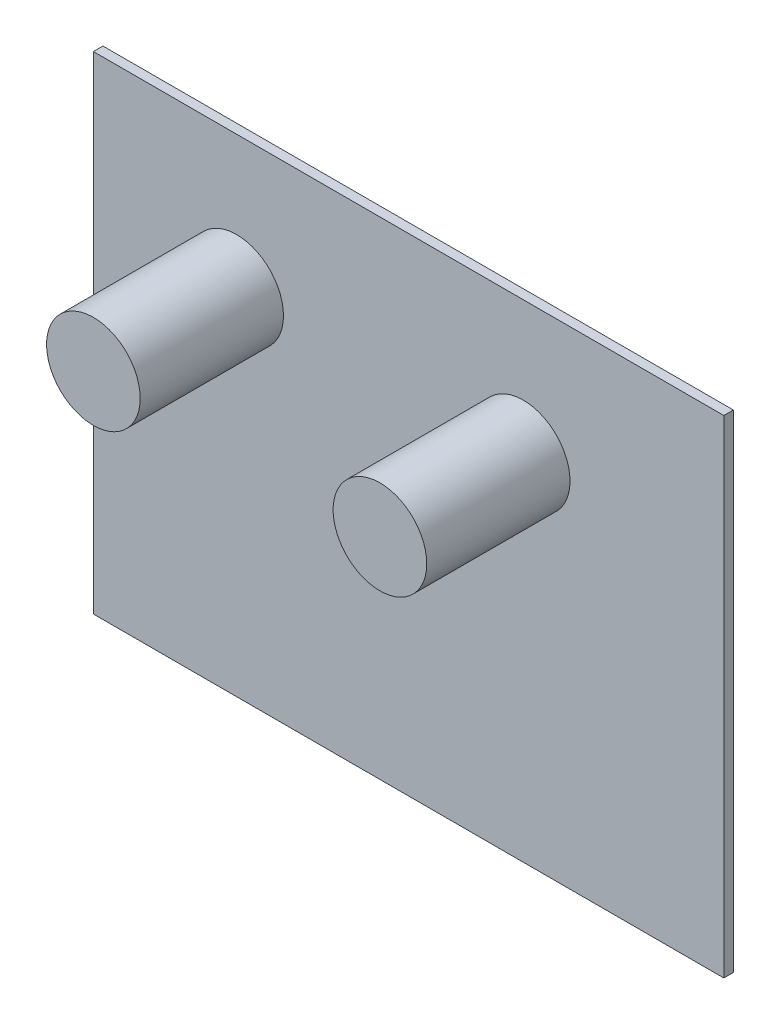
ISO-10303-21;
HEADER;
FILE_DESCRIPTION(('STEP AP214'),'2;1');
FILE_NAME('part.step','',(''),(''),'','','');
FILE_SCHEMA(('AUTOMOTIVE_DESIGN { 1 0 10303 214 1 1 1 1 }'));
ENDSEC;
DATA;
#1=APPLICATION_CONTEXT('core data for automotive mechanical design processes');
#2=APPLICATION_PROTOCOL_DEFINITION('international standard','automotive_design',2000,#1);
#3=PRODUCT_CONTEXT('',#1,'mechanical');
#4=PRODUCT('Part','Part','',(#3));
#5=PRODUCT_RELATED_PRODUCT_CATEGORY('part','',(#4));
#6=PRODUCT_DEFINITION_FORMATION('','',#4);
#7=PRODUCT_DEFINITION_CONTEXT('part definition',#1,'design');
#8=PRODUCT_DEFINITION('design','',#6,#7);
#9=PRODUCT_DEFINITION_SHAPE('','',#8);
#10=(LENGTH_UNIT() NAMED_UNIT(*) SI_UNIT(.MILLI.,.METRE.));
#11=(NAMED_UNIT(*) PLANE_ANGLE_UNIT() SI_UNIT($,.RADIAN.));
#12=(NAMED_UNIT(*) SI_UNIT($,.STERADIAN.) SOLID_ANGLE_UNIT());
#13=UNCERTAINTY_MEASURE_WITH_UNIT(LENGTH_MEASURE(1.E-05),#10,'distance_accuracy_value','');
#14=(GEOMETRIC_REPRESENTATION_CONTEXT(3) GLOBAL_UNCERTAINTY_ASSIGNED_CONTEXT((#13)) GLOBAL_UNIT_ASSIGNED_CONTEXT((#10,
#11,#12)) REPRESENTATION_CONTEXT('',''));
#15=CARTESIAN_POINT('',(0.,0.,0.));
#16=DIRECTION('',(0.,0.,1.));
#17=DIRECTION('',(1.,0.,0.));
#18=AXIS2_PLACEMENT_3D('',#15,#16,#17);
#19=CARTESIAN_POINT('',(0.,0.,1.));
#20=DIRECTION('',(0.,1.,0.));
#21=DIRECTION('',(0.,0.,1.));
#22=AXIS2_PLACEMENT_3D('',#19,#20,#21);
#23=PLANE('',#22);
#24=DIRECTION('',(1.,0.,0.));
#25=VECTOR('',#24,1.);
#26=CARTESIAN_POINT('',(0.,0.,0.));
#27=LINE('',#26,#25);
#28=CARTESIAN_POINT('',(0.,0.,0.));
#29=VERTEX_POINT('',#28);
#30=CARTESIAN_POINT('',(66.,0.,0.));
#31=VERTEX_POINT('',#30);
#32=EDGE_CURVE('E115',#29,#31,#27,.T.);
#33=ORIENTED_EDGE('',*,*,#32,.T.);
#34=DIRECTION('',(0.,0.,-1.));
#35=VECTOR('',#34,1.);
#36=CARTESIAN_POINT('',(66.,0.,1.));
#37=LINE('',#36,#35);
#38=CARTESIAN_POINT('',(66.,0.,1.));
#39=VERTEX_POINT('',#38);
#40=EDGE_CURVE('E12',#39,#31,#37,.T.);
#41=ORIENTED_EDGE('',*,*,#40,.F.);
#42=DIRECTION('',(1.,0.,0.));
#43=VECTOR('',#42,1.);
#44=CARTESIAN_POINT('',(0.,0.,1.));
#45=LINE('',#44,#43);
#46=CARTESIAN_POINT('',(0.,0.,1.));
#47=VERTEX_POINT('',#46);
#48=EDGE_CURVE('E97',#47,#39,#45,.T.);
#49=ORIENTED_EDGE('',*,*,#48,.F.);
#50=DIRECTION('',(0.,0.,-1.));
#51=VECTOR('',#50,1.);
#52=CARTESIAN_POINT('',(0.,0.,1.));
#53=LINE('',#52,#51);
#54=EDGE_CURVE('E64',#47,#29,#53,.T.);
#55=ORIENTED_EDGE('',*,*,#54,.T.);
#56=EDGE_LOOP('',(#33,#41,#49,#55));
#57=FACE_BOUND('',#56,.T.);
#58=ADVANCED_FACE('F47',(#57),#23,.F.);
#59=CARTESIAN_POINT('',(66.,0.,1.));
#60=DIRECTION('',(-1.,0.,0.));
#61=DIRECTION('',(0.,0.,1.));
#62=AXIS2_PLACEMENT_3D('',#59,#60,#61);
#63=PLANE('',#62);
#64=DIRECTION('',(0.,1.,0.));
#65=VECTOR('',#64,1.);
#66=CARTESIAN_POINT('',(66.,0.,0.));
#67=LINE('',#66,#65);
#68=CARTESIAN_POINT('',(66.,51.,0.));
#69=VERTEX_POINT('',#68);
#70=EDGE_CURVE('E103',#31,#69,#67,.T.);
#71=ORIENTED_EDGE('',*,*,#70,.T.);
#72=DIRECTION('',(0.,0.,-1.));
#73=VECTOR('',#72,1.);
#74=CARTESIAN_POINT('',(66.,51.,1.));
#75=LINE('',#74,#73);
#76=CARTESIAN_POINT('',(66.,51.,1.));
#77=VERTEX_POINT('',#76);
#78=EDGE_CURVE('E56',#77,#69,#75,.T.);
#79=ORIENTED_EDGE('',*,*,#78,.F.);
#80=DIRECTION('',(0.,1.,0.));
#81=VECTOR('',#80,1.);
#82=CARTESIAN_POINT('',(66.,0.,1.));
#83=LINE('',#82,#81);
#84=EDGE_CURVE('E89',#39,#77,#83,.T.);
#85=ORIENTED_EDGE('',*,*,#84,.F.);
#86=ORIENTED_EDGE('',*,*,#40,.T.);
#87=EDGE_LOOP('',(#71,#79,#85,#86));
#88=FACE_BOUND('',#87,.T.);
#89=ADVANCED_FACE('F102',(#88),#63,.F.);
#90=CARTESIAN_POINT('',(0.,51.,1.));
#91=DIRECTION('',(0.,1.,0.));
#92=DIRECTION('',(0.,0.,1.));
#93=AXIS2_PLACEMENT_3D('',#90,#91,#92);
#94=PLANE('',#93);
#95=DIRECTION('',(1.,0.,0.));
#96=VECTOR('',#95,1.);
#97=CARTESIAN_POINT('',(0.,51.,0.));
#98=LINE('',#97,#96);
#99=CARTESIAN_POINT('',(0.,51.,0.));
#100=VERTEX_POINT('',#99);
#101=EDGE_CURVE('E121',#100,#69,#98,.T.);
#102=ORIENTED_EDGE('',*,*,#101,.F.);
#103=DIRECTION('',(0.,0.,-1.));
#104=VECTOR('',#103,1.);
#105=CARTESIAN_POINT('',(0.,51.,1.));
#106=LINE('',#105,#104);
#107=CARTESIAN_POINT('',(0.,51.,1.));
#108=VERTEX_POINT('',#107);
#109=EDGE_CURVE('E78',#108,#100,#106,.T.);
#110=ORIENTED_EDGE('',*,*,#109,.F.);
#111=DIRECTION('',(1.,0.,0.));
#112=VECTOR('',#111,1.);
#113=CARTESIAN_POINT('',(0.,51.,1.));
#114=LINE('',#113,#112);
#115=EDGE_CURVE('E96',#108,#77,#114,.T.);
#116=ORIENTED_EDGE('',*,*,#115,.T.);
#117=ORIENTED_EDGE('',*,*,#78,.T.);
#118=EDGE_LOOP('',(#102,#110,#116,#117));
#119=FACE_BOUND('',#118,.T.);
#120=ADVANCED_FACE('F107',(#119),#94,.T.);
#121=CARTESIAN_POINT('',(0.,0.,1.));
#122=DIRECTION('',(-1.,0.,0.));
#123=DIRECTION('',(0.,0.,1.));
#124=AXIS2_PLACEMENT_3D('',#121,#122,#123);
#125=PLANE('',#124);
#126=DIRECTION('',(0.,1.,0.));
#127=VECTOR('',#126,1.);
#128=CARTESIAN_POINT('',(0.,0.,0.));
#129=LINE('',#128,#127);
#130=EDGE_CURVE('E124',#29,#100,#129,.T.);
#131=ORIENTED_EDGE('',*,*,#130,.F.);
#132=ORIENTED_EDGE('',*,*,#54,.F.);
#133=DIRECTION('',(0.,1.,0.));
#134=VECTOR('',#133,1.);
#135=CARTESIAN_POINT('',(0.,0.,1.));
#136=LINE('',#135,#134);
#137=EDGE_CURVE('E109',#47,#108,#136,.T.);
#138=ORIENTED_EDGE('',*,*,#137,.T.);
#139=ORIENTED_EDGE('',*,*,#109,.T.);
#140=EDGE_LOOP('',(#131,#132,#138,#139));
#141=FACE_BOUND('',#140,.T.);
#142=ADVANCED_FACE('F155',(#141),#125,.T.);
#143=CARTESIAN_POINT('',(0.,0.,1.));
#144=DIRECTION('',(0.,0.,1.));
#145=DIRECTION('',(1.,0.,0.));
#146=AXIS2_PLACEMENT_3D('',#143,#144,#145);
#147=PLANE('',#146);
#148=CARTESIAN_POINT('',(45.,37.,1.));
#149=DIRECTION('',(0.,0.,1.));
#150=DIRECTION('',(1.,0.,0.));
#151=AXIS2_PLACEMENT_3D('',#148,#149,#150);
#152=CIRCLE('',#151,4.9);
#153=CARTESIAN_POINT('',(49.9,37.,1.));
#154=VERTEX_POINT('',#153);
#155=EDGE_CURVE('E138',#154,#154,#152,.T.);
#156=ORIENTED_EDGE('',*,*,#155,.F.);
#157=EDGE_LOOP('',(#156));
#158=FACE_BOUND('',#157,.T.);
#159=CARTESIAN_POINT('',(15.,37.,1.));
#160=DIRECTION('',(0.,0.,1.));
#161=DIRECTION('',(1.,0.,0.));
#162=AXIS2_PLACEMENT_3D('',#159,#160,#161);
#163=CIRCLE('',#162,4.90000000000001);
#164=CARTESIAN_POINT('',(19.9,37.,1.));
#165=VERTEX_POINT('',#164);
#166=EDGE_CURVE('E134',#165,#165,#163,.T.);
#167=ORIENTED_EDGE('',*,*,#166,.F.);
#168=EDGE_LOOP('',(#167));
#169=FACE_BOUND('',#168,.T.);
#170=ORIENTED_EDGE('',*,*,#48,.T.);
#171=ORIENTED_EDGE('',*,*,#84,.T.);
#172=ORIENTED_EDGE('',*,*,#115,.F.);
#173=ORIENTED_EDGE('',*,*,#137,.F.);
#174=EDGE_LOOP('',(#170,#171,#172,#173));
#175=FACE_BOUND('',#174,.T.);
#176=ADVANCED_FACE('F93',(#158,#169,#175),#147,.T.);
#177=CARTESIAN_POINT('',(0.,0.,0.));
#178=DIRECTION('',(0.,0.,1.));
#179=DIRECTION('',(1.,0.,0.));
#180=AXIS2_PLACEMENT_3D('',#177,#178,#179);
#181=PLANE('',#180);
#182=ORIENTED_EDGE('',*,*,#32,.F.);
#183=ORIENTED_EDGE('',*,*,#130,.T.);
#184=ORIENTED_EDGE('',*,*,#101,.T.);
#185=ORIENTED_EDGE('',*,*,#70,.F.);
#186=EDGE_LOOP('',(#182,#183,#184,#185));
#187=FACE_BOUND('',#186,.T.);
#188=ADVANCED_FACE('F154',(#187),#181,.F.);
#189=CARTESIAN_POINT('',(15.,37.,16.));
#190=DIRECTION('',(0.,0.,-1.));
#191=DIRECTION('',(-1.,0.,0.));
#192=AXIS2_PLACEMENT_3D('',#189,#190,#191);
#193=CYLINDRICAL_SURFACE('',#192,4.90000000000001);
#194=CARTESIAN_POINT('',(15.,37.,16.));
#195=DIRECTION('',(0.,0.,1.));
#196=DIRECTION('',(1.,0.,0.));
#197=AXIS2_PLACEMENT_3D('',#194,#195,#196);
#198=CIRCLE('',#197,4.90000000000001);
#199=CARTESIAN_POINT('',(19.9,37.,16.));
#200=VERTEX_POINT('',#199);
#201=EDGE_CURVE('E118',#200,#200,#198,.T.);
#202=ORIENTED_EDGE('',*,*,#201,.F.);
#203=EDGE_LOOP('',(#202));
#204=FACE_BOUND('',#203,.T.);
#205=ORIENTED_EDGE('',*,*,#166,.T.);
#206=EDGE_LOOP('',(#205));
#207=FACE_BOUND('',#206,.T.);
#208=ADVANCED_FACE('F159',(#204,#207),#193,.T.);
#209=CARTESIAN_POINT('',(0.,0.,16.));
#210=DIRECTION('',(0.,0.,1.));
#211=DIRECTION('',(1.,0.,0.));
#212=AXIS2_PLACEMENT_3D('',#209,#210,#211);
#213=PLANE('',#212);
#214=ORIENTED_EDGE('',*,*,#201,.T.);
#215=EDGE_LOOP('',(#214));
#216=FACE_BOUND('',#215,.T.);
#217=ADVANCED_FACE('F161',(#216),#213,.T.);
#218=CARTESIAN_POINT('',(45.,37.,16.));
#219=DIRECTION('',(0.,0.,-1.));
#220=DIRECTION('',(-1.,0.,0.));
#221=AXIS2_PLACEMENT_3D('',#218,#219,#220);
#222=CYLINDRICAL_SURFACE('',#221,4.9);
#223=CARTESIAN_POINT('',(45.,37.,16.));
#224=DIRECTION('',(0.,0.,1.));
#225=DIRECTION('',(1.,0.,0.));
#226=AXIS2_PLACEMENT_3D('',#223,#224,#225);
#227=CIRCLE('',#226,4.9);
#228=CARTESIAN_POINT('',(49.9,37.,16.));
#229=VERTEX_POINT('',#228);
#230=EDGE_CURVE('E142',#229,#229,#227,.T.);
#231=ORIENTED_EDGE('',*,*,#230,.F.);
#232=EDGE_LOOP('',(#231));
#233=FACE_BOUND('',#232,.T.);
#234=ORIENTED_EDGE('',*,*,#155,.T.);
#235=EDGE_LOOP('',(#234));
#236=FACE_BOUND('',#235,.T.);
#237=ADVANCED_FACE('F150',(#233,#236),#222,.T.);
#238=CARTESIAN_POINT('',(0.,0.,16.));
#239=DIRECTION('',(0.,0.,1.));
#240=DIRECTION('',(1.,0.,0.));
#241=AXIS2_PLACEMENT_3D('',#238,#239,#240);
#242=PLANE('',#241);
#243=ORIENTED_EDGE('',*,*,#230,.T.);
#244=EDGE_LOOP('',(#243));
#245=FACE_BOUND('',#244,.T.);
#246=ADVANCED_FACE('F227',(#245),#242,.T.);
#247=CLOSED_SHELL('',(#58,#89,#120,#142,#176,#188,#208,#217,#237,#246));
#248=MANIFOLD_SOLID_BREP('B2',#247);
#249=ADVANCED_BREP_SHAPE_REPRESENTATION('',(#18,#248),#14);
#250=SHAPE_DEFINITION_REPRESENTATION(#9,#249);
ENDSEC;
END-ISO-10303-21;
